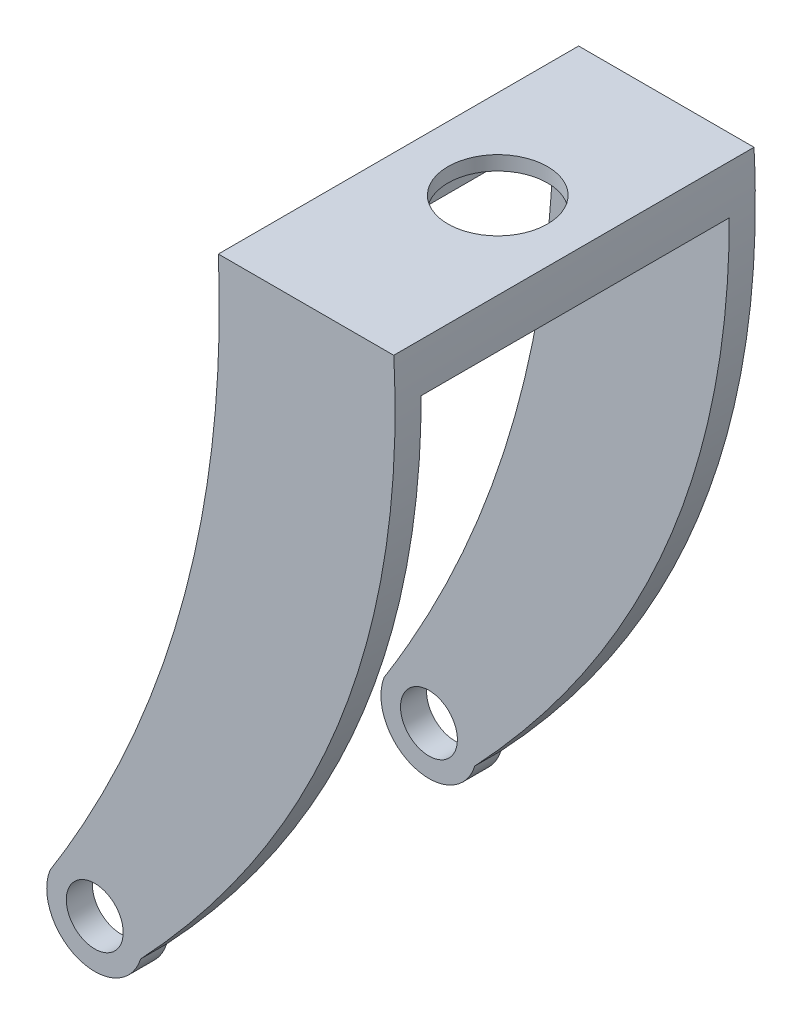
ISO-10303-21;
HEADER;
FILE_DESCRIPTION(('STEP AP214'),'2;1');
FILE_NAME('part.step','',(''),(''),'','','');
FILE_SCHEMA(('AUTOMOTIVE_DESIGN { 1 0 10303 214 1 1 1 1 }'));
ENDSEC;
DATA;
#1=APPLICATION_CONTEXT('core data for automotive mechanical design processes');
#2=APPLICATION_PROTOCOL_DEFINITION('international standard','automotive_design',2000,#1);
#3=PRODUCT_CONTEXT('',#1,'mechanical');
#4=PRODUCT('Part','Part','',(#3));
#5=PRODUCT_RELATED_PRODUCT_CATEGORY('part','',(#4));
#6=PRODUCT_DEFINITION_FORMATION('','',#4);
#7=PRODUCT_DEFINITION_CONTEXT('part definition',#1,'design');
#8=PRODUCT_DEFINITION('design','',#6,#7);
#9=PRODUCT_DEFINITION_SHAPE('','',#8);
#10=(LENGTH_UNIT() NAMED_UNIT(*) SI_UNIT(.MILLI.,.METRE.));
#11=(NAMED_UNIT(*) PLANE_ANGLE_UNIT() SI_UNIT($,.RADIAN.));
#12=(NAMED_UNIT(*) SI_UNIT($,.STERADIAN.) SOLID_ANGLE_UNIT());
#13=UNCERTAINTY_MEASURE_WITH_UNIT(LENGTH_MEASURE(1.E-05),#10,'distance_accuracy_value','');
#14=(GEOMETRIC_REPRESENTATION_CONTEXT(3) GLOBAL_UNCERTAINTY_ASSIGNED_CONTEXT((#13)) GLOBAL_UNIT_ASSIGNED_CONTEXT((#10,
#11,#12)) REPRESENTATION_CONTEXT('',''));
#15=CARTESIAN_POINT('',(0.,0.,0.));
#16=DIRECTION('',(0.,0.,1.));
#17=DIRECTION('',(1.,0.,0.));
#18=AXIS2_PLACEMENT_3D('',#15,#16,#17);
#19=CARTESIAN_POINT('',(-83.,19.985380116959,70.5));
#20=DIRECTION('',(0.,1.,0.));
#21=DIRECTION('',(0.,0.,1.));
#22=AXIS2_PLACEMENT_3D('',#19,#20,#21);
#23=PLANE('',#22);
#24=DIRECTION('',(1.,0.,0.));
#25=VECTOR('',#24,1.);
#26=CARTESIAN_POINT('',(-83.,19.985380116959,5.50000000000001));
#27=LINE('',#26,#25);
#28=CARTESIAN_POINT('',(3.82506357644098,19.985380116959,5.50000000000001));
#29=VERTEX_POINT('',#28);
#30=CARTESIAN_POINT('',(40.9007092876351,19.985380116959,5.50000000000001));
#31=VERTEX_POINT('',#30);
#32=EDGE_CURVE('E217',#29,#31,#27,.T.);
#33=ORIENTED_EDGE('',*,*,#32,.T.);
#34=DIRECTION('',(0.,0.,-1.));
#35=VECTOR('',#34,1.);
#36=CARTESIAN_POINT('',(40.9007092876351,19.985380116959,76.));
#37=LINE('',#36,#35);
#38=CARTESIAN_POINT('',(40.9007092876351,19.985380116959,70.5));
#39=VERTEX_POINT('',#38);
#40=EDGE_CURVE('E11',#39,#31,#37,.T.);
#41=ORIENTED_EDGE('',*,*,#40,.F.);
#42=DIRECTION('',(1.,0.,0.));
#43=VECTOR('',#42,1.);
#44=CARTESIAN_POINT('',(-83.,19.985380116959,70.5));
#45=LINE('',#44,#43);
#46=CARTESIAN_POINT('',(3.82506357644098,19.985380116959,70.5));
#47=VERTEX_POINT('',#46);
#48=EDGE_CURVE('E230',#47,#39,#45,.T.);
#49=ORIENTED_EDGE('',*,*,#48,.F.);
#50=DIRECTION('',(0.,0.,-1.));
#51=VECTOR('',#50,1.);
#52=CARTESIAN_POINT('',(3.82506357644098,19.985380116959,76.));
#53=LINE('',#52,#51);
#54=EDGE_CURVE('E270',#29,#47,#53,.F.);
#55=ORIENTED_EDGE('',*,*,#54,.F.);
#56=EDGE_LOOP('',(#33,#41,#49,#55));
#57=FACE_BOUND('',#56,.T.);
#58=CARTESIAN_POINT('',(33.9007092876351,19.985380116959,11.8603668983935));
#59=DIRECTION('',(0.,-1.,0.));
#60=DIRECTION('',(0.,0.,1.));
#61=AXIS2_PLACEMENT_3D('',#58,#59,#60);
#62=CIRCLE('',#61,4.);
#63=CARTESIAN_POINT('',(33.900709287635,19.985380116959,7.86036689839349));
#64=VERTEX_POINT('',#63);
#65=CARTESIAN_POINT('',(37.9007092876351,19.985380116959,11.8603668983935));
#66=VERTEX_POINT('',#65);
#67=EDGE_CURVE('E59',#64,#66,#62,.T.);
#68=ORIENTED_EDGE('',*,*,#67,.F.);
#69=DIRECTION('',(1.,0.,0.));
#70=VECTOR('',#69,1.);
#71=CARTESIAN_POINT('',(10.825063576441,19.985380116959,7.86036689839349));
#72=LINE('',#71,#70);
#73=CARTESIAN_POINT('',(10.825063576441,19.985380116959,7.86036689839349));
#74=VERTEX_POINT('',#73);
#75=EDGE_CURVE('E180',#74,#64,#72,.T.);
#76=ORIENTED_EDGE('',*,*,#75,.F.);
#77=CARTESIAN_POINT('',(10.825063576441,19.985380116959,11.8603668983935));
#78=DIRECTION('',(0.,-1.,0.));
#79=DIRECTION('',(0.,0.,1.));
#80=AXIS2_PLACEMENT_3D('',#77,#78,#79);
#81=CIRCLE('',#80,4.);
#82=CARTESIAN_POINT('',(6.82506357644099,19.985380116959,11.8603668983935));
#83=VERTEX_POINT('',#82);
#84=EDGE_CURVE('E179',#83,#74,#81,.T.);
#85=ORIENTED_EDGE('',*,*,#84,.F.);
#86=DIRECTION('',(0.,0.,-1.));
#87=VECTOR('',#86,1.);
#88=CARTESIAN_POINT('',(6.82506357644098,19.985380116959,59.7390221610005));
#89=LINE('',#88,#87);
#90=CARTESIAN_POINT('',(6.82506357644099,19.985380116959,59.7390221610005));
#91=VERTEX_POINT('',#90);
#92=EDGE_CURVE('E208',#91,#83,#89,.T.);
#93=ORIENTED_EDGE('',*,*,#92,.F.);
#94=CARTESIAN_POINT('',(10.825063576441,19.985380116959,59.7390221610005));
#95=DIRECTION('',(0.,-1.,0.));
#96=DIRECTION('',(0.,0.,1.));
#97=AXIS2_PLACEMENT_3D('',#94,#95,#96);
#98=CIRCLE('',#97,3.99999999999999);
#99=CARTESIAN_POINT('',(10.825063576441,19.985380116959,63.7390221610005));
#100=VERTEX_POINT('',#99);
#101=EDGE_CURVE('E210',#100,#91,#98,.T.);
#102=ORIENTED_EDGE('',*,*,#101,.F.);
#103=DIRECTION('',(-1.,0.,0.));
#104=VECTOR('',#103,1.);
#105=CARTESIAN_POINT('',(10.825063576441,19.985380116959,63.7390221610005));
#106=LINE('',#105,#104);
#107=CARTESIAN_POINT('',(33.900709287635,19.985380116959,63.7390221610005));
#108=VERTEX_POINT('',#107);
#109=EDGE_CURVE('E204',#108,#100,#106,.T.);
#110=ORIENTED_EDGE('',*,*,#109,.F.);
#111=CARTESIAN_POINT('',(33.9007092876351,19.985380116959,59.7390221610005));
#112=DIRECTION('',(0.,-1.,0.));
#113=DIRECTION('',(0.,0.,1.));
#114=AXIS2_PLACEMENT_3D('',#111,#112,#113);
#115=CIRCLE('',#114,4.);
#116=CARTESIAN_POINT('',(37.9007092876351,19.985380116959,59.7390221610005));
#117=VERTEX_POINT('',#116);
#118=EDGE_CURVE('E203',#117,#108,#115,.T.);
#119=ORIENTED_EDGE('',*,*,#118,.F.);
#120=DIRECTION('',(0.,0.,1.));
#121=VECTOR('',#120,1.);
#122=CARTESIAN_POINT('',(37.9007092876351,19.985380116959,59.7390221610005));
#123=LINE('',#122,#121);
#124=EDGE_CURVE('E198',#66,#117,#123,.T.);
#125=ORIENTED_EDGE('',*,*,#124,.F.);
#126=EDGE_LOOP('',(#68,#76,#85,#93,#102,#110,#119,#125));
#127=FACE_BOUND('',#126,.T.);
#128=ADVANCED_FACE('F41',(#57,#127),#23,.F.);
#129=CARTESIAN_POINT('',(-22.4511392506351,-104.014619883041,76.));
#130=DIRECTION('',(0.,0.,-1.));
#131=DIRECTION('',(-1.,0.,0.));
#132=AXIS2_PLACEMENT_3D('',#129,#130,#131);
#133=CYLINDRICAL_SURFACE('',#132,10.125);
#134=CARTESIAN_POINT('',(-22.4511392506351,-104.014619883041,70.5));
#135=DIRECTION('',(0.,0.,1.));
#136=DIRECTION('',(1.,0.,0.));
#137=AXIS2_PLACEMENT_3D('',#134,#135,#136);
#138=CIRCLE('',#137,10.125);
#139=CARTESIAN_POINT('',(-31.8823650724117,-100.331196950678,70.5));
#140=VERTEX_POINT('',#139);
#141=CARTESIAN_POINT('',(-12.7759545159607,-106.998983357875,70.5));
#142=VERTEX_POINT('',#141);
#143=EDGE_CURVE('E260',#140,#142,#138,.T.);
#144=ORIENTED_EDGE('',*,*,#143,.T.);
#145=DIRECTION('',(0.,0.,-1.));
#146=VECTOR('',#145,1.);
#147=CARTESIAN_POINT('',(-12.7759545159607,-106.998983357875,76.));
#148=LINE('',#147,#146);
#149=CARTESIAN_POINT('',(-12.7759545159607,-106.998983357875,76.));
#150=VERTEX_POINT('',#149);
#151=EDGE_CURVE('E379',#150,#142,#148,.T.);
#152=ORIENTED_EDGE('',*,*,#151,.F.);
#153=CARTESIAN_POINT('',(-22.4511392506351,-104.014619883041,76.));
#154=DIRECTION('',(0.,0.,1.));
#155=DIRECTION('',(1.,0.,0.));
#156=AXIS2_PLACEMENT_3D('',#153,#154,#155);
#157=CIRCLE('',#156,10.125);
#158=CARTESIAN_POINT('',(-31.8823650724117,-100.331196950678,76.));
#159=VERTEX_POINT('',#158);
#160=EDGE_CURVE('E285',#159,#150,#157,.T.);
#161=ORIENTED_EDGE('',*,*,#160,.F.);
#162=DIRECTION('',(0.,0.,-1.));
#163=VECTOR('',#162,1.);
#164=CARTESIAN_POINT('',(-31.8823650724117,-100.331196950678,76.));
#165=LINE('',#164,#163);
#166=EDGE_CURVE('E51',#159,#140,#165,.T.);
#167=ORIENTED_EDGE('',*,*,#166,.T.);
#168=EDGE_LOOP('',(#144,#152,#161,#167));
#169=FACE_BOUND('',#168,.T.);
#170=ADVANCED_FACE('F311',(#169),#133,.T.);
#171=CARTESIAN_POINT('',(-22.4511392506351,-104.014619883041,76.));
#172=DIRECTION('',(0.,0.,-1.));
#173=DIRECTION('',(-1.,0.,0.));
#174=AXIS2_PLACEMENT_3D('',#171,#172,#173);
#175=CYLINDRICAL_SURFACE('',#174,6.);
#176=CARTESIAN_POINT('',(-22.4511392506351,-104.014619883041,70.5));
#177=DIRECTION('',(0.,0.,1.));
#178=DIRECTION('',(1.,0.,0.));
#179=AXIS2_PLACEMENT_3D('',#176,#177,#178);
#180=CIRCLE('',#179,6.);
#181=CARTESIAN_POINT('',(-16.4511392506351,-104.014619883041,70.5));
#182=VERTEX_POINT('',#181);
#183=EDGE_CURVE('E247',#182,#182,#180,.T.);
#184=ORIENTED_EDGE('',*,*,#183,.F.);
#185=EDGE_LOOP('',(#184));
#186=FACE_BOUND('',#185,.T.);
#187=CARTESIAN_POINT('',(-22.4511392506351,-104.014619883041,76.));
#188=DIRECTION('',(0.,0.,1.));
#189=DIRECTION('',(1.,0.,0.));
#190=AXIS2_PLACEMENT_3D('',#187,#188,#189);
#191=CIRCLE('',#190,6.);
#192=CARTESIAN_POINT('',(-16.4511392506351,-104.014619883041,76.));
#193=VERTEX_POINT('',#192);
#194=EDGE_CURVE('E274',#193,#193,#191,.T.);
#195=ORIENTED_EDGE('',*,*,#194,.T.);
#196=EDGE_LOOP('',(#195));
#197=FACE_BOUND('',#196,.T.);
#198=ADVANCED_FACE('F316',(#186,#197),#175,.F.);
#199=CARTESIAN_POINT('',(-3.80952263664726,-36.9908227408832,76.));
#200=DIRECTION('',(0.,0.,1.));
#201=DIRECTION('',(1.,0.,0.));
#202=AXIS2_PLACEMENT_3D('',#199,#200,#201);
#203=PLANE('',#202);
#204=CARTESIAN_POINT('',(3.62356021341673,29.985380116959,76.));
#205=CARTESIAN_POINT('',(6.51035715620297,-38.8087370649067,76.));
#206=CARTESIAN_POINT('',(-31.8823650724117,-100.331196950678,76.));
#207=B_SPLINE_CURVE_WITH_KNOTS('',2,(#204,#205,#206),.UNSPECIFIED.,.F.,.F.,(3,3),(0.,1.),.UNSPECIFIED.);
#208=CARTESIAN_POINT('',(3.62356021341673,29.985380116959,76.));
#209=VERTEX_POINT('',#208);
#210=EDGE_CURVE('E276',#209,#159,#207,.T.);
#211=ORIENTED_EDGE('',*,*,#210,.T.);
#212=ORIENTED_EDGE('',*,*,#160,.T.);
#213=CARTESIAN_POINT('',(-12.7759545159607,-106.998983357875,76.));
#214=CARTESIAN_POINT('',(44.7579879140139,-45.9340877439921,76.));
#215=CARTESIAN_POINT('',(40.6235602134167,29.985380116959,76.));
#216=B_SPLINE_CURVE_WITH_KNOTS('',2,(#213,#214,#215),.UNSPECIFIED.,.F.,.F.,(3,3),(0.,1.),.UNSPECIFIED.);
#217=CARTESIAN_POINT('',(40.6235602134167,29.985380116959,76.));
#218=VERTEX_POINT('',#217);
#219=EDGE_CURVE('E293',#150,#218,#216,.T.);
#220=ORIENTED_EDGE('',*,*,#219,.T.);
#221=DIRECTION('',(-1.,0.,0.));
#222=VECTOR('',#221,1.);
#223=CARTESIAN_POINT('',(3.62356021341673,29.985380116959,76.));
#224=LINE('',#223,#222);
#225=EDGE_CURVE('E298',#218,#209,#224,.T.);
#226=ORIENTED_EDGE('',*,*,#225,.T.);
#227=EDGE_LOOP('',(#211,#212,#220,#226));
#228=FACE_BOUND('',#227,.T.);
#229=ORIENTED_EDGE('',*,*,#194,.F.);
#230=EDGE_LOOP('',(#229));
#231=FACE_BOUND('',#230,.T.);
#232=ADVANCED_FACE('F338',(#228,#231),#203,.T.);
#233=CARTESIAN_POINT('',(-3.80952263664726,-36.9908227408832,0.));
#234=DIRECTION('',(0.,0.,1.));
#235=DIRECTION('',(1.,0.,0.));
#236=AXIS2_PLACEMENT_3D('',#233,#234,#235);
#237=PLANE('',#236);
#238=CARTESIAN_POINT('',(3.62356021341673,29.985380116959,0.));
#239=CARTESIAN_POINT('',(6.51035715620297,-38.8087370649067,0.));
#240=CARTESIAN_POINT('',(-31.8823650724117,-100.331196950678,0.));
#241=B_SPLINE_CURVE_WITH_KNOTS('',2,(#238,#239,#240),.UNSPECIFIED.,.F.,.F.,(3,3),(0.,1.),.UNSPECIFIED.);
#242=CARTESIAN_POINT('',(3.62356021341673,29.985380116959,0.));
#243=VERTEX_POINT('',#242);
#244=CARTESIAN_POINT('',(-31.8823650724117,-100.331196950678,0.));
#245=VERTEX_POINT('',#244);
#246=EDGE_CURVE('E280',#243,#245,#241,.T.);
#247=ORIENTED_EDGE('',*,*,#246,.F.);
#248=DIRECTION('',(-1.,0.,0.));
#249=VECTOR('',#248,1.);
#250=CARTESIAN_POINT('',(3.62356021341673,29.985380116959,0.));
#251=LINE('',#250,#249);
#252=CARTESIAN_POINT('',(40.6235602134167,29.985380116959,0.));
#253=VERTEX_POINT('',#252);
#254=EDGE_CURVE('E288',#253,#243,#251,.T.);
#255=ORIENTED_EDGE('',*,*,#254,.F.);
#256=CARTESIAN_POINT('',(-12.7759545159607,-106.998983357875,0.));
#257=CARTESIAN_POINT('',(44.7579879140139,-45.9340877439921,0.));
#258=CARTESIAN_POINT('',(40.6235602134167,29.985380116959,0.));
#259=B_SPLINE_CURVE_WITH_KNOTS('',2,(#256,#257,#258),.UNSPECIFIED.,.F.,.F.,(3,3),(0.,1.),.UNSPECIFIED.);
#260=CARTESIAN_POINT('',(-12.7759545159607,-106.998983357875,0.));
#261=VERTEX_POINT('',#260);
#262=EDGE_CURVE('E360',#261,#253,#259,.T.);
#263=ORIENTED_EDGE('',*,*,#262,.F.);
#264=CARTESIAN_POINT('',(-22.4511392506351,-104.014619883041,0.));
#265=DIRECTION('',(0.,0.,1.));
#266=DIRECTION('',(1.,0.,0.));
#267=AXIS2_PLACEMENT_3D('',#264,#265,#266);
#268=CIRCLE('',#267,10.125);
#269=EDGE_CURVE('E358',#245,#261,#268,.T.);
#270=ORIENTED_EDGE('',*,*,#269,.F.);
#271=EDGE_LOOP('',(#247,#255,#263,#270));
#272=FACE_BOUND('',#271,.T.);
#273=CARTESIAN_POINT('',(-22.4511392506351,-104.014619883041,0.));
#274=DIRECTION('',(0.,0.,1.));
#275=DIRECTION('',(1.,0.,0.));
#276=AXIS2_PLACEMENT_3D('',#273,#274,#275);
#277=CIRCLE('',#276,6.);
#278=CARTESIAN_POINT('',(-16.4511392506351,-104.014619883041,0.));
#279=VERTEX_POINT('',#278);
#280=EDGE_CURVE('E271',#279,#279,#277,.T.);
#281=ORIENTED_EDGE('',*,*,#280,.T.);
#282=EDGE_LOOP('',(#281));
#283=FACE_BOUND('',#282,.T.);
#284=ADVANCED_FACE('F314',(#272,#283),#237,.F.);
#285=DIRECTION('',(0.,0.,-1.));
#286=VECTOR('',#285,1.);
#287=SURFACE_OF_LINEAR_EXTRUSION('',#207,#286);
#288=ORIENTED_EDGE('',*,*,#54,.T.);
#289=CARTESIAN_POINT('',(3.62356021341673,29.985380116959,70.5));
#290=CARTESIAN_POINT('',(6.51035715620297,-38.8087370649067,70.5));
#291=CARTESIAN_POINT('',(-31.8823650724117,-100.331196950678,70.5));
#292=B_SPLINE_CURVE_WITH_KNOTS('',2,(#289,#290,#291),.UNSPECIFIED.,.F.,.F.,(3,3),(0.,1.),.UNSPECIFIED.);
#293=EDGE_CURVE('E262',#47,#140,#292,.T.);
#294=ORIENTED_EDGE('',*,*,#293,.T.);
#295=ORIENTED_EDGE('',*,*,#166,.F.);
#296=ORIENTED_EDGE('',*,*,#210,.F.);
#297=DIRECTION('',(0.,0.,-1.));
#298=VECTOR('',#297,1.);
#299=CARTESIAN_POINT('',(3.62356021341673,29.985380116959,76.));
#300=LINE('',#299,#298);
#301=EDGE_CURVE('E372',#209,#243,#300,.T.);
#302=ORIENTED_EDGE('',*,*,#301,.T.);
#303=ORIENTED_EDGE('',*,*,#246,.T.);
#304=CARTESIAN_POINT('',(-31.8823650724117,-100.331196950678,5.49999999999999));
#305=VERTEX_POINT('',#304);
#306=EDGE_CURVE('E384',#305,#245,#165,.T.);
#307=ORIENTED_EDGE('',*,*,#306,.F.);
#308=CARTESIAN_POINT('',(3.62356021341673,29.985380116959,5.50000000000001));
#309=CARTESIAN_POINT('',(6.51035715620297,-38.8087370649067,5.50000000000001));
#310=CARTESIAN_POINT('',(-31.8823650724117,-100.331196950678,5.50000000000001));
#311=B_SPLINE_CURVE_WITH_KNOTS('',2,(#308,#309,#310),.UNSPECIFIED.,.F.,.F.,(3,3),(0.,1.),.UNSPECIFIED.);
#312=EDGE_CURVE('E243',#305,#29,#311,.F.);
#313=ORIENTED_EDGE('',*,*,#312,.T.);
#314=EDGE_LOOP('',(#288,#294,#295,#296,#302,#303,#307,#313));
#315=FACE_BOUND('',#314,.T.);
#316=ADVANCED_FACE('F43',(#315),#287,.F.);
#317=CARTESIAN_POINT('',(-12.7759545159607,-106.998983357875,5.50000000000001));
#318=VERTEX_POINT('',#317);
#319=EDGE_CURVE('E378',#318,#261,#148,.T.);
#320=ORIENTED_EDGE('',*,*,#319,.F.);
#321=CARTESIAN_POINT('',(-22.4511392506351,-104.014619883041,5.49999999999999));
#322=DIRECTION('',(0.,0.,-1.));
#323=DIRECTION('',(0.,1.,0.));
#324=AXIS2_PLACEMENT_3D('',#321,#322,#323);
#325=CIRCLE('',#324,10.125);
#326=EDGE_CURVE('E66',#318,#305,#325,.T.);
#327=ORIENTED_EDGE('',*,*,#326,.T.);
#328=ORIENTED_EDGE('',*,*,#306,.T.);
#329=ORIENTED_EDGE('',*,*,#269,.T.);
#330=EDGE_LOOP('',(#320,#327,#328,#329));
#331=FACE_BOUND('',#330,.T.);
#332=ADVANCED_FACE('F306',(#331),#133,.T.);
#333=DIRECTION('',(0.,0.,-1.));
#334=VECTOR('',#333,1.);
#335=SURFACE_OF_LINEAR_EXTRUSION('',#216,#334);
#336=ORIENTED_EDGE('',*,*,#151,.T.);
#337=CARTESIAN_POINT('',(-12.7759545159607,-106.998983357875,70.5));
#338=CARTESIAN_POINT('',(44.7579879140139,-45.9340877439921,70.5));
#339=CARTESIAN_POINT('',(40.6235602134167,29.985380116959,70.5));
#340=B_SPLINE_CURVE_WITH_KNOTS('',2,(#337,#338,#339),.UNSPECIFIED.,.F.,.F.,(3,3),(0.,1.),.UNSPECIFIED.);
#341=EDGE_CURVE('E248',#142,#39,#340,.T.);
#342=ORIENTED_EDGE('',*,*,#341,.T.);
#343=ORIENTED_EDGE('',*,*,#40,.T.);
#344=CARTESIAN_POINT('',(-12.7759545159607,-106.998983357875,5.50000000000001));
#345=CARTESIAN_POINT('',(44.7579879140139,-45.9340877439921,5.50000000000001));
#346=CARTESIAN_POINT('',(40.6235602134167,29.985380116959,5.50000000000001));
#347=B_SPLINE_CURVE_WITH_KNOTS('',2,(#344,#345,#346),.UNSPECIFIED.,.F.,.F.,(3,3),(0.,1.),.UNSPECIFIED.);
#348=EDGE_CURVE('E232',#31,#318,#347,.F.);
#349=ORIENTED_EDGE('',*,*,#348,.T.);
#350=ORIENTED_EDGE('',*,*,#319,.T.);
#351=ORIENTED_EDGE('',*,*,#262,.T.);
#352=DIRECTION('',(0.,0.,-1.));
#353=VECTOR('',#352,1.);
#354=CARTESIAN_POINT('',(40.6235602134167,29.985380116959,76.));
#355=LINE('',#354,#353);
#356=EDGE_CURVE('E376',#218,#253,#355,.T.);
#357=ORIENTED_EDGE('',*,*,#356,.F.);
#358=ORIENTED_EDGE('',*,*,#219,.F.);
#359=EDGE_LOOP('',(#336,#342,#343,#349,#350,#351,#357,#358));
#360=FACE_BOUND('',#359,.T.);
#361=ADVANCED_FACE('F305',(#360),#335,.F.);
#362=CARTESIAN_POINT('',(3.62356021341673,29.985380116959,76.));
#363=DIRECTION('',(0.,-1.,0.));
#364=DIRECTION('',(0.,0.,-1.));
#365=AXIS2_PLACEMENT_3D('',#362,#363,#364);
#366=PLANE('',#365);
#367=CARTESIAN_POINT('',(22.362886432038,29.985380116959,35.799694529697));
#368=DIRECTION('',(0.,-1.,0.));
#369=DIRECTION('',(0.,0.,-1.));
#370=AXIS2_PLACEMENT_3D('',#367,#368,#369);
#371=CIRCLE('',#370,10.5);
#372=CARTESIAN_POINT('',(22.362886432038,29.985380116959,25.299694529697));
#373=VERTEX_POINT('',#372);
#374=EDGE_CURVE('E46',#373,#373,#371,.T.);
#375=ORIENTED_EDGE('',*,*,#374,.T.);
#376=EDGE_LOOP('',(#375));
#377=FACE_BOUND('',#376,.T.);
#378=ORIENTED_EDGE('',*,*,#254,.T.);
#379=ORIENTED_EDGE('',*,*,#301,.F.);
#380=ORIENTED_EDGE('',*,*,#225,.F.);
#381=ORIENTED_EDGE('',*,*,#356,.T.);
#382=EDGE_LOOP('',(#378,#379,#380,#381));
#383=FACE_BOUND('',#382,.T.);
#384=ADVANCED_FACE('F304',(#377,#383),#366,.F.);
#385=CARTESIAN_POINT('',(-22.4511392506351,-104.014619883041,5.49999999999999));
#386=DIRECTION('',(0.,0.,-1.));
#387=DIRECTION('',(0.,1.,0.));
#388=AXIS2_PLACEMENT_3D('',#385,#386,#387);
#389=CIRCLE('',#388,6.);
#390=CARTESIAN_POINT('',(-22.4511392506351,-98.014619883041,5.49999999999999));
#391=VERTEX_POINT('',#390);
#392=EDGE_CURVE('E235',#391,#391,#389,.T.);
#393=ORIENTED_EDGE('',*,*,#392,.F.);
#394=EDGE_LOOP('',(#393));
#395=FACE_BOUND('',#394,.T.);
#396=ORIENTED_EDGE('',*,*,#280,.F.);
#397=EDGE_LOOP('',(#396));
#398=FACE_BOUND('',#397,.T.);
#399=ADVANCED_FACE('F337',(#395,#398),#175,.F.);
#400=CARTESIAN_POINT('',(-83.,-114.139619883041,70.5));
#401=DIRECTION('',(0.,0.,1.));
#402=DIRECTION('',(1.,0.,0.));
#403=AXIS2_PLACEMENT_3D('',#400,#401,#402);
#404=PLANE('',#403);
#405=ORIENTED_EDGE('',*,*,#183,.T.);
#406=EDGE_LOOP('',(#405));
#407=FACE_BOUND('',#406,.T.);
#408=ORIENTED_EDGE('',*,*,#48,.T.);
#409=ORIENTED_EDGE('',*,*,#341,.F.);
#410=ORIENTED_EDGE('',*,*,#143,.F.);
#411=ORIENTED_EDGE('',*,*,#293,.F.);
#412=EDGE_LOOP('',(#408,#409,#410,#411));
#413=FACE_BOUND('',#412,.T.);
#414=ADVANCED_FACE('F333',(#407,#413),#404,.F.);
#415=CARTESIAN_POINT('',(-83.,19.985380116959,5.50000000000001));
#416=DIRECTION('',(0.,0.,-1.));
#417=DIRECTION('',(0.,1.,0.));
#418=AXIS2_PLACEMENT_3D('',#415,#416,#417);
#419=PLANE('',#418);
#420=ORIENTED_EDGE('',*,*,#392,.T.);
#421=EDGE_LOOP('',(#420));
#422=FACE_BOUND('',#421,.T.);
#423=ORIENTED_EDGE('',*,*,#326,.F.);
#424=ORIENTED_EDGE('',*,*,#348,.F.);
#425=ORIENTED_EDGE('',*,*,#32,.F.);
#426=ORIENTED_EDGE('',*,*,#312,.F.);
#427=EDGE_LOOP('',(#423,#424,#425,#426));
#428=FACE_BOUND('',#427,.T.);
#429=ADVANCED_FACE('F331',(#422,#428),#419,.F.);
#430=CARTESIAN_POINT('',(33.9007092876351,26.985380116959,11.8603668983935));
#431=DIRECTION('',(0.,-1.,0.));
#432=DIRECTION('',(0.,0.,-1.));
#433=AXIS2_PLACEMENT_3D('',#430,#431,#432);
#434=CYLINDRICAL_SURFACE('',#433,4.);
#435=ORIENTED_EDGE('',*,*,#67,.T.);
#436=DIRECTION('',(0.,-1.,0.));
#437=VECTOR('',#436,1.);
#438=CARTESIAN_POINT('',(37.9007092876351,26.985380116959,11.8603668983935));
#439=LINE('',#438,#437);
#440=CARTESIAN_POINT('',(37.9007092876351,26.985380116959,11.8603668983935));
#441=VERTEX_POINT('',#440);
#442=EDGE_CURVE('E153',#441,#66,#439,.T.);
#443=ORIENTED_EDGE('',*,*,#442,.F.);
#444=CARTESIAN_POINT('',(33.9007092876351,26.985380116959,11.8603668983935));
#445=DIRECTION('',(0.,-1.,0.));
#446=DIRECTION('',(0.,0.,1.));
#447=AXIS2_PLACEMENT_3D('',#444,#445,#446);
#448=CIRCLE('',#447,4.);
#449=CARTESIAN_POINT('',(33.900709287635,26.985380116959,7.86036689839349));
#450=VERTEX_POINT('',#449);
#451=EDGE_CURVE('E156',#450,#441,#448,.T.);
#452=ORIENTED_EDGE('',*,*,#451,.F.);
#453=DIRECTION('',(0.,-1.,0.));
#454=VECTOR('',#453,1.);
#455=CARTESIAN_POINT('',(33.900709287635,26.985380116959,7.86036689839349));
#456=LINE('',#455,#454);
#457=EDGE_CURVE('E213',#450,#64,#456,.T.);
#458=ORIENTED_EDGE('',*,*,#457,.T.);
#459=EDGE_LOOP('',(#435,#443,#452,#458));
#460=FACE_BOUND('',#459,.T.);
#461=ADVANCED_FACE('F158',(#460),#434,.F.);
#462=CARTESIAN_POINT('',(10.825063576441,26.985380116959,7.86036689839349));
#463=DIRECTION('',(0.,0.,-1.));
#464=DIRECTION('',(0.,1.,0.));
#465=AXIS2_PLACEMENT_3D('',#462,#463,#464);
#466=PLANE('',#465);
#467=ORIENTED_EDGE('',*,*,#75,.T.);
#468=ORIENTED_EDGE('',*,*,#457,.F.);
#469=DIRECTION('',(1.,0.,0.));
#470=VECTOR('',#469,1.);
#471=CARTESIAN_POINT('',(10.825063576441,26.985380116959,7.86036689839349));
#472=LINE('',#471,#470);
#473=CARTESIAN_POINT('',(10.825063576441,26.985380116959,7.86036689839349));
#474=VERTEX_POINT('',#473);
#475=EDGE_CURVE('E165',#474,#450,#472,.T.);
#476=ORIENTED_EDGE('',*,*,#475,.F.);
#477=DIRECTION('',(0.,-1.,0.));
#478=VECTOR('',#477,1.);
#479=CARTESIAN_POINT('',(10.825063576441,26.985380116959,7.86036689839349));
#480=LINE('',#479,#478);
#481=EDGE_CURVE('E219',#474,#74,#480,.T.);
#482=ORIENTED_EDGE('',*,*,#481,.T.);
#483=EDGE_LOOP('',(#467,#468,#476,#482));
#484=FACE_BOUND('',#483,.T.);
#485=ADVANCED_FACE('F470',(#484),#466,.F.);
#486=CARTESIAN_POINT('',(10.825063576441,26.985380116959,11.8603668983935));
#487=DIRECTION('',(0.,-1.,0.));
#488=DIRECTION('',(0.,0.,-1.));
#489=AXIS2_PLACEMENT_3D('',#486,#487,#488);
#490=CYLINDRICAL_SURFACE('',#489,4.);
#491=ORIENTED_EDGE('',*,*,#84,.T.);
#492=ORIENTED_EDGE('',*,*,#481,.F.);
#493=CARTESIAN_POINT('',(10.825063576441,26.985380116959,11.8603668983935));
#494=DIRECTION('',(0.,-1.,0.));
#495=DIRECTION('',(0.,0.,1.));
#496=AXIS2_PLACEMENT_3D('',#493,#494,#495);
#497=CIRCLE('',#496,4.);
#498=CARTESIAN_POINT('',(6.82506357644099,26.985380116959,11.8603668983935));
#499=VERTEX_POINT('',#498);
#500=EDGE_CURVE('E193',#499,#474,#497,.T.);
#501=ORIENTED_EDGE('',*,*,#500,.F.);
#502=DIRECTION('',(0.,-1.,0.));
#503=VECTOR('',#502,1.);
#504=CARTESIAN_POINT('',(6.82506357644099,26.985380116959,11.8603668983935));
#505=LINE('',#504,#503);
#506=EDGE_CURVE('E220',#499,#83,#505,.T.);
#507=ORIENTED_EDGE('',*,*,#506,.T.);
#508=EDGE_LOOP('',(#491,#492,#501,#507));
#509=FACE_BOUND('',#508,.T.);
#510=ADVANCED_FACE('F473',(#509),#490,.F.);
#511=CARTESIAN_POINT('',(6.82506357644098,26.985380116959,59.7390221610005));
#512=DIRECTION('',(-1.,0.,0.));
#513=DIRECTION('',(0.,0.,1.));
#514=AXIS2_PLACEMENT_3D('',#511,#512,#513);
#515=PLANE('',#514);
#516=ORIENTED_EDGE('',*,*,#92,.T.);
#517=ORIENTED_EDGE('',*,*,#506,.F.);
#518=DIRECTION('',(0.,0.,-1.));
#519=VECTOR('',#518,1.);
#520=CARTESIAN_POINT('',(6.82506357644098,26.985380116959,59.7390221610005));
#521=LINE('',#520,#519);
#522=CARTESIAN_POINT('',(6.82506357644099,26.985380116959,59.7390221610005));
#523=VERTEX_POINT('',#522);
#524=EDGE_CURVE('E195',#523,#499,#521,.T.);
#525=ORIENTED_EDGE('',*,*,#524,.F.);
#526=DIRECTION('',(0.,-1.,0.));
#527=VECTOR('',#526,1.);
#528=CARTESIAN_POINT('',(6.82506357644099,26.985380116959,59.7390221610005));
#529=LINE('',#528,#527);
#530=EDGE_CURVE('E225',#523,#91,#529,.T.);
#531=ORIENTED_EDGE('',*,*,#530,.T.);
#532=EDGE_LOOP('',(#516,#517,#525,#531));
#533=FACE_BOUND('',#532,.T.);
#534=ADVANCED_FACE('F482',(#533),#515,.F.);
#535=CARTESIAN_POINT('',(10.825063576441,26.985380116959,59.7390221610005));
#536=DIRECTION('',(0.,-1.,0.));
#537=DIRECTION('',(0.,0.,-1.));
#538=AXIS2_PLACEMENT_3D('',#535,#536,#537);
#539=CYLINDRICAL_SURFACE('',#538,3.99999999999999);
#540=ORIENTED_EDGE('',*,*,#101,.T.);
#541=ORIENTED_EDGE('',*,*,#530,.F.);
#542=CARTESIAN_POINT('',(10.825063576441,26.985380116959,59.7390221610005));
#543=DIRECTION('',(0.,-1.,0.));
#544=DIRECTION('',(0.,0.,1.));
#545=AXIS2_PLACEMENT_3D('',#542,#543,#544);
#546=CIRCLE('',#545,3.99999999999999);
#547=CARTESIAN_POINT('',(10.825063576441,26.985380116959,63.7390221610005));
#548=VERTEX_POINT('',#547);
#549=EDGE_CURVE('E186',#548,#523,#546,.T.);
#550=ORIENTED_EDGE('',*,*,#549,.F.);
#551=DIRECTION('',(0.,-1.,0.));
#552=VECTOR('',#551,1.);
#553=CARTESIAN_POINT('',(10.825063576441,26.985380116959,63.7390221610005));
#554=LINE('',#553,#552);
#555=EDGE_CURVE('E224',#548,#100,#554,.T.);
#556=ORIENTED_EDGE('',*,*,#555,.T.);
#557=EDGE_LOOP('',(#540,#541,#550,#556));
#558=FACE_BOUND('',#557,.T.);
#559=ADVANCED_FACE('F492',(#558),#539,.F.);
#560=CARTESIAN_POINT('',(10.825063576441,26.985380116959,63.7390221610005));
#561=DIRECTION('',(0.,0.,1.));
#562=DIRECTION('',(0.,-1.,0.));
#563=AXIS2_PLACEMENT_3D('',#560,#561,#562);
#564=PLANE('',#563);
#565=ORIENTED_EDGE('',*,*,#109,.T.);
#566=ORIENTED_EDGE('',*,*,#555,.F.);
#567=DIRECTION('',(-1.,0.,0.));
#568=VECTOR('',#567,1.);
#569=CARTESIAN_POINT('',(10.825063576441,26.985380116959,63.7390221610005));
#570=LINE('',#569,#568);
#571=CARTESIAN_POINT('',(33.900709287635,26.985380116959,63.7390221610005));
#572=VERTEX_POINT('',#571);
#573=EDGE_CURVE('E187',#572,#548,#570,.T.);
#574=ORIENTED_EDGE('',*,*,#573,.F.);
#575=DIRECTION('',(0.,-1.,0.));
#576=VECTOR('',#575,1.);
#577=CARTESIAN_POINT('',(33.900709287635,26.985380116959,63.7390221610005));
#578=LINE('',#577,#576);
#579=EDGE_CURVE('E228',#572,#108,#578,.T.);
#580=ORIENTED_EDGE('',*,*,#579,.T.);
#581=EDGE_LOOP('',(#565,#566,#574,#580));
#582=FACE_BOUND('',#581,.T.);
#583=ADVANCED_FACE('F504',(#582),#564,.F.);
#584=CARTESIAN_POINT('',(33.9007092876351,26.985380116959,59.7390221610005));
#585=DIRECTION('',(0.,-1.,0.));
#586=DIRECTION('',(0.,0.,-1.));
#587=AXIS2_PLACEMENT_3D('',#584,#585,#586);
#588=CYLINDRICAL_SURFACE('',#587,4.);
#589=ORIENTED_EDGE('',*,*,#118,.T.);
#590=ORIENTED_EDGE('',*,*,#579,.F.);
#591=CARTESIAN_POINT('',(33.9007092876351,26.985380116959,59.7390221610005));
#592=DIRECTION('',(0.,-1.,0.));
#593=DIRECTION('',(0.,0.,1.));
#594=AXIS2_PLACEMENT_3D('',#591,#592,#593);
#595=CIRCLE('',#594,4.);
#596=CARTESIAN_POINT('',(37.9007092876351,26.985380116959,59.7390221610005));
#597=VERTEX_POINT('',#596);
#598=EDGE_CURVE('E175',#597,#572,#595,.T.);
#599=ORIENTED_EDGE('',*,*,#598,.F.);
#600=DIRECTION('',(0.,-1.,0.));
#601=VECTOR('',#600,1.);
#602=CARTESIAN_POINT('',(37.9007092876351,26.985380116959,59.7390221610005));
#603=LINE('',#602,#601);
#604=EDGE_CURVE('E161',#597,#117,#603,.T.);
#605=ORIENTED_EDGE('',*,*,#604,.T.);
#606=EDGE_LOOP('',(#589,#590,#599,#605));
#607=FACE_BOUND('',#606,.T.);
#608=ADVANCED_FACE('F513',(#607),#588,.F.);
#609=CARTESIAN_POINT('',(37.9007092876351,26.985380116959,59.7390221610005));
#610=DIRECTION('',(1.,0.,0.));
#611=DIRECTION('',(0.,0.,-1.));
#612=AXIS2_PLACEMENT_3D('',#609,#610,#611);
#613=PLANE('',#612);
#614=ORIENTED_EDGE('',*,*,#124,.T.);
#615=ORIENTED_EDGE('',*,*,#604,.F.);
#616=DIRECTION('',(0.,0.,1.));
#617=VECTOR('',#616,1.);
#618=CARTESIAN_POINT('',(37.9007092876351,26.985380116959,59.7390221610005));
#619=LINE('',#618,#617);
#620=EDGE_CURVE('E170',#441,#597,#619,.T.);
#621=ORIENTED_EDGE('',*,*,#620,.F.);
#622=ORIENTED_EDGE('',*,*,#442,.T.);
#623=EDGE_LOOP('',(#614,#615,#621,#622));
#624=FACE_BOUND('',#623,.T.);
#625=ADVANCED_FACE('F166',(#624),#613,.F.);
#626=CARTESIAN_POINT('',(33.9007092876351,26.985380116959,11.8603668983935));
#627=DIRECTION('',(0.,1.,0.));
#628=DIRECTION('',(0.,0.,1.));
#629=AXIS2_PLACEMENT_3D('',#626,#627,#628);
#630=PLANE('',#629);
#631=CARTESIAN_POINT('',(22.362886432038,26.985380116959,35.799694529697));
#632=DIRECTION('',(0.,-1.,0.));
#633=DIRECTION('',(0.,0.,-1.));
#634=AXIS2_PLACEMENT_3D('',#631,#632,#633);
#635=CIRCLE('',#634,10.5);
#636=CARTESIAN_POINT('',(22.362886432038,26.985380116959,25.299694529697));
#637=VERTEX_POINT('',#636);
#638=EDGE_CURVE('E182',#637,#637,#635,.T.);
#639=ORIENTED_EDGE('',*,*,#638,.F.);
#640=EDGE_LOOP('',(#639));
#641=FACE_BOUND('',#640,.T.);
#642=ORIENTED_EDGE('',*,*,#451,.T.);
#643=ORIENTED_EDGE('',*,*,#620,.T.);
#644=ORIENTED_EDGE('',*,*,#598,.T.);
#645=ORIENTED_EDGE('',*,*,#573,.T.);
#646=ORIENTED_EDGE('',*,*,#549,.T.);
#647=ORIENTED_EDGE('',*,*,#524,.T.);
#648=ORIENTED_EDGE('',*,*,#500,.T.);
#649=ORIENTED_EDGE('',*,*,#475,.T.);
#650=EDGE_LOOP('',(#642,#643,#644,#645,#646,#647,#648,#649));
#651=FACE_BOUND('',#650,.T.);
#652=ADVANCED_FACE('F172',(#641,#651),#630,.F.);
#653=CARTESIAN_POINT('',(22.362886432038,33.985380116959,35.799694529697));
#654=DIRECTION('',(0.,-1.,0.));
#655=DIRECTION('',(0.,0.,-1.));
#656=AXIS2_PLACEMENT_3D('',#653,#654,#655);
#657=CYLINDRICAL_SURFACE('',#656,10.5);
#658=ORIENTED_EDGE('',*,*,#638,.T.);
#659=EDGE_LOOP('',(#658));
#660=FACE_BOUND('',#659,.T.);
#661=ORIENTED_EDGE('',*,*,#374,.F.);
#662=EDGE_LOOP('',(#661));
#663=FACE_BOUND('',#662,.T.);
#664=ADVANCED_FACE('F538',(#660,#663),#657,.F.);
#665=CLOSED_SHELL('',(#128,#170,#198,#232,#284,#316,#332,#361,#384,#399,#414,#429,#461,#485,
#510,#534,#559,#583,#608,#625,#652,#664));
#666=MANIFOLD_SOLID_BREP('B2',#665);
#667=ADVANCED_BREP_SHAPE_REPRESENTATION('',(#18,#666),#14);
#668=SHAPE_DEFINITION_REPRESENTATION(#9,#667);
ENDSEC;
END-ISO-10303-21;
